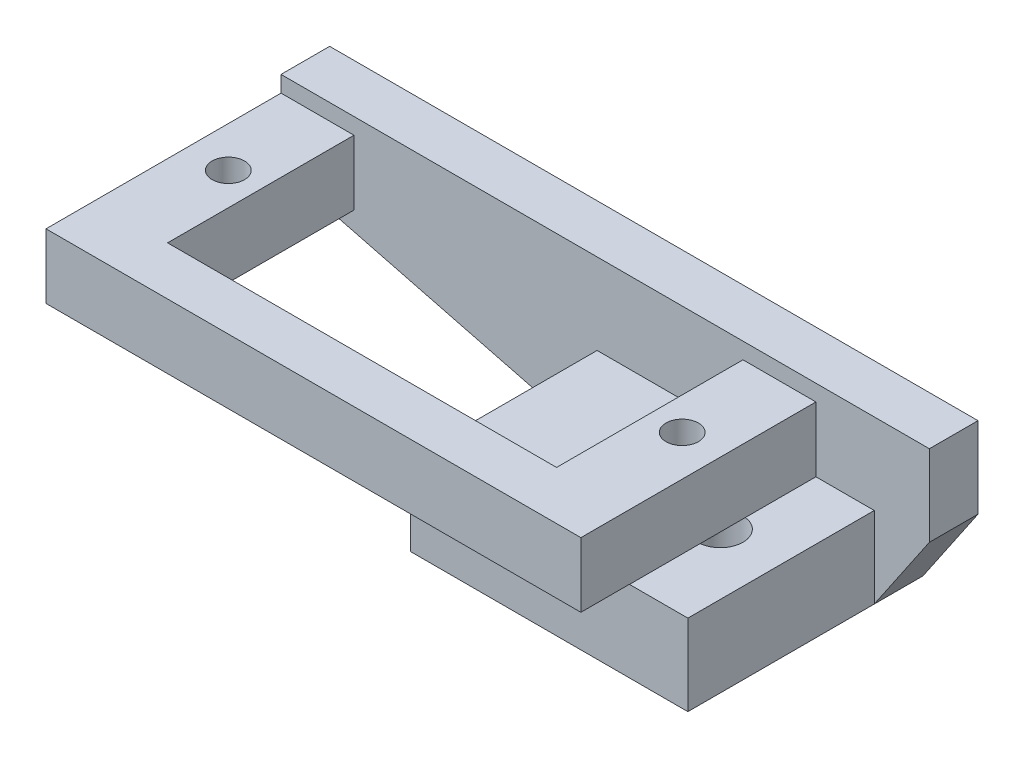
ISO-10303-21;
HEADER;
FILE_DESCRIPTION(('STEP AP214'),'2;1');
FILE_NAME('part.step','',(''),(''),'','','');
FILE_SCHEMA(('AUTOMOTIVE_DESIGN { 1 0 10303 214 1 1 1 1 }'));
ENDSEC;
DATA;
#1=APPLICATION_CONTEXT('core data for automotive mechanical design processes');
#2=APPLICATION_PROTOCOL_DEFINITION('international standard','automotive_design',2000,#1);
#3=PRODUCT_CONTEXT('',#1,'mechanical');
#4=PRODUCT('Part','Part','',(#3));
#5=PRODUCT_RELATED_PRODUCT_CATEGORY('part','',(#4));
#6=PRODUCT_DEFINITION_FORMATION('','',#4);
#7=PRODUCT_DEFINITION_CONTEXT('part definition',#1,'design');
#8=PRODUCT_DEFINITION('design','',#6,#7);
#9=PRODUCT_DEFINITION_SHAPE('','',#8);
#10=(LENGTH_UNIT() NAMED_UNIT(*) SI_UNIT(.MILLI.,.METRE.));
#11=(NAMED_UNIT(*) PLANE_ANGLE_UNIT() SI_UNIT($,.RADIAN.));
#12=(NAMED_UNIT(*) SI_UNIT($,.STERADIAN.) SOLID_ANGLE_UNIT());
#13=UNCERTAINTY_MEASURE_WITH_UNIT(LENGTH_MEASURE(1.E-05),#10,'distance_accuracy_value','');
#14=(GEOMETRIC_REPRESENTATION_CONTEXT(3) GLOBAL_UNCERTAINTY_ASSIGNED_CONTEXT((#13)) GLOBAL_UNIT_ASSIGNED_CONTEXT((#10,
#11,#12)) REPRESENTATION_CONTEXT('',''));
#15=CARTESIAN_POINT('',(0.,0.,0.));
#16=DIRECTION('',(0.,0.,1.));
#17=DIRECTION('',(1.,0.,0.));
#18=AXIS2_PLACEMENT_3D('',#15,#16,#17);
#19=CARTESIAN_POINT('',(0.,0.,14.5));
#20=DIRECTION('',(0.,0.,-1.));
#21=DIRECTION('',(-1.,0.,0.));
#22=AXIS2_PLACEMENT_3D('',#19,#20,#21);
#23=PLANE('',#22);
#24=DIRECTION('',(1.,0.,0.));
#25=VECTOR('',#24,1.);
#26=CARTESIAN_POINT('',(0.,-2.49,14.5));
#27=LINE('',#26,#25);
#28=CARTESIAN_POINT('',(-20.,-2.49,14.5));
#29=VERTEX_POINT('',#28);
#30=CARTESIAN_POINT('',(-15.5,-2.49,14.5));
#31=VERTEX_POINT('',#30);
#32=EDGE_CURVE('E51',#29,#31,#27,.T.);
#33=ORIENTED_EDGE('',*,*,#32,.F.);
#34=DIRECTION('',(0.,-1.,0.));
#35=VECTOR('',#34,1.);
#36=CARTESIAN_POINT('',(-20.,-2.5,14.5));
#37=LINE('',#36,#35);
#38=CARTESIAN_POINT('',(-20.,-2.5,14.5));
#39=VERTEX_POINT('',#38);
#40=EDGE_CURVE('E318',#29,#39,#37,.T.);
#41=ORIENTED_EDGE('',*,*,#40,.T.);
#42=DIRECTION('',(1.,0.,0.));
#43=VECTOR('',#42,1.);
#44=CARTESIAN_POINT('',(-20.,-2.5,14.5));
#45=LINE('',#44,#43);
#46=CARTESIAN_POINT('',(-15.5,-2.5,14.5));
#47=VERTEX_POINT('',#46);
#48=EDGE_CURVE('E320',#39,#47,#45,.T.);
#49=ORIENTED_EDGE('',*,*,#48,.T.);
#50=DIRECTION('',(0.,1.,0.));
#51=VECTOR('',#50,1.);
#52=CARTESIAN_POINT('',(-15.5,-2.5,14.5));
#53=LINE('',#52,#51);
#54=EDGE_CURVE('E323',#47,#31,#53,.T.);
#55=ORIENTED_EDGE('',*,*,#54,.T.);
#56=EDGE_LOOP('',(#33,#41,#49,#55));
#57=FACE_BOUND('',#56,.T.);
#58=ADVANCED_FACE('F40',(#57),#23,.F.);
#59=CARTESIAN_POINT('',(0.,0.,14.5));
#60=DIRECTION('',(0.,0.,-1.));
#61=DIRECTION('',(-1.,0.,0.));
#62=AXIS2_PLACEMENT_3D('',#59,#60,#61);
#63=PLANE('',#62);
#64=CARTESIAN_POINT('',(8.49999999999998,-2.49,14.5));
#65=VERTEX_POINT('',#64);
#66=CARTESIAN_POINT('',(13.,-2.49,14.5));
#67=VERTEX_POINT('',#66);
#68=EDGE_CURVE('E12',#65,#67,#27,.T.);
#69=ORIENTED_EDGE('',*,*,#68,.F.);
#70=DIRECTION('',(0.,-1.,0.));
#71=VECTOR('',#70,1.);
#72=CARTESIAN_POINT('',(8.49999999999998,-2.5,14.5));
#73=LINE('',#72,#71);
#74=CARTESIAN_POINT('',(8.49999999999999,-2.5,14.5));
#75=VERTEX_POINT('',#74);
#76=EDGE_CURVE('E297',#65,#75,#73,.T.);
#77=ORIENTED_EDGE('',*,*,#76,.T.);
#78=DIRECTION('',(-1.,0.,0.));
#79=VECTOR('',#78,1.);
#80=CARTESIAN_POINT('',(16.6,-2.5,14.5));
#81=LINE('',#80,#79);
#82=CARTESIAN_POINT('',(-0.499999999999997,-2.5,14.5));
#83=VERTEX_POINT('',#82);
#84=EDGE_CURVE('E274',#75,#83,#81,.T.);
#85=ORIENTED_EDGE('',*,*,#84,.T.);
#86=DIRECTION('',(0.,1.,0.));
#87=VECTOR('',#86,1.);
#88=CARTESIAN_POINT('',(-0.499999999999997,-7.5,14.5));
#89=LINE('',#88,#87);
#90=CARTESIAN_POINT('',(-0.499999999999997,-7.5,14.5));
#91=VERTEX_POINT('',#90);
#92=EDGE_CURVE('E272',#91,#83,#89,.T.);
#93=ORIENTED_EDGE('',*,*,#92,.F.);
#94=DIRECTION('',(-1.,0.,0.));
#95=VECTOR('',#94,1.);
#96=CARTESIAN_POINT('',(16.6,-7.5,14.5));
#97=LINE('',#96,#95);
#98=CARTESIAN_POINT('',(16.6,-7.5,14.5));
#99=VERTEX_POINT('',#98);
#100=EDGE_CURVE('E264',#99,#91,#97,.T.);
#101=ORIENTED_EDGE('',*,*,#100,.F.);
#102=DIRECTION('',(0.,1.,0.));
#103=VECTOR('',#102,1.);
#104=CARTESIAN_POINT('',(16.6,-7.5,14.5));
#105=LINE('',#104,#103);
#106=CARTESIAN_POINT('',(16.6,-2.5,14.5));
#107=VERTEX_POINT('',#106);
#108=EDGE_CURVE('E280',#99,#107,#105,.T.);
#109=ORIENTED_EDGE('',*,*,#108,.T.);
#110=CARTESIAN_POINT('',(13.,-2.5,14.5));
#111=VERTEX_POINT('',#110);
#112=EDGE_CURVE('E190',#107,#111,#81,.T.);
#113=ORIENTED_EDGE('',*,*,#112,.T.);
#114=DIRECTION('',(0.,1.,0.));
#115=VECTOR('',#114,1.);
#116=CARTESIAN_POINT('',(13.,-2.5,14.5));
#117=LINE('',#116,#115);
#118=EDGE_CURVE('E186',#111,#67,#117,.T.);
#119=ORIENTED_EDGE('',*,*,#118,.T.);
#120=EDGE_LOOP('',(#69,#77,#85,#93,#101,#109,#113,#119));
#121=FACE_BOUND('',#120,.T.);
#122=ADVANCED_FACE('F187',(#121),#63,.F.);
#123=CARTESIAN_POINT('',(0.,-7.5,0.));
#124=DIRECTION('',(0.,-1.,0.));
#125=DIRECTION('',(0.,0.,-1.));
#126=AXIS2_PLACEMENT_3D('',#123,#124,#125);
#127=PLANE('',#126);
#128=CARTESIAN_POINT('',(12.85,-7.5,8.75));
#129=DIRECTION('',(0.,-1.,0.));
#130=DIRECTION('',(0.,0.,-1.));
#131=AXIS2_PLACEMENT_3D('',#128,#129,#130);
#132=CIRCLE('',#131,3.40000000000001);
#133=CARTESIAN_POINT('',(12.85,-7.5,5.34999999999999));
#134=VERTEX_POINT('',#133);
#135=EDGE_CURVE('E366',#134,#134,#132,.F.);
#136=ORIENTED_EDGE('',*,*,#135,.T.);
#137=EDGE_LOOP('',(#136));
#138=FACE_BOUND('',#137,.T.);
#139=DIRECTION('',(0.,0.,1.));
#140=VECTOR('',#139,1.);
#141=CARTESIAN_POINT('',(16.6,-7.5,0.));
#142=LINE('',#141,#140);
#143=CARTESIAN_POINT('',(16.6,-7.5,0.));
#144=VERTEX_POINT('',#143);
#145=CARTESIAN_POINT('',(16.6,-7.5,3.));
#146=VERTEX_POINT('',#145);
#147=EDGE_CURVE('E262',#144,#146,#142,.T.);
#148=ORIENTED_EDGE('',*,*,#147,.T.);
#149=EDGE_CURVE('E265',#146,#99,#142,.T.);
#150=ORIENTED_EDGE('',*,*,#149,.T.);
#151=ORIENTED_EDGE('',*,*,#100,.T.);
#152=DIRECTION('',(0.,0.,-1.));
#153=VECTOR('',#152,1.);
#154=CARTESIAN_POINT('',(-0.499999999999997,-7.5,0.));
#155=LINE('',#154,#153);
#156=CARTESIAN_POINT('',(-0.499999999999997,-7.5,3.));
#157=VERTEX_POINT('',#156);
#158=EDGE_CURVE('E267',#91,#157,#155,.T.);
#159=ORIENTED_EDGE('',*,*,#158,.T.);
#160=DIRECTION('',(0.,0.,-1.));
#161=VECTOR('',#160,1.);
#162=CARTESIAN_POINT('',(-0.499999999999997,-7.5,23.1308221391974));
#163=LINE('',#162,#161);
#164=CARTESIAN_POINT('',(-0.499999999999997,-7.5,0.));
#165=VERTEX_POINT('',#164);
#166=EDGE_CURVE('E241',#157,#165,#163,.T.);
#167=ORIENTED_EDGE('',*,*,#166,.T.);
#168=DIRECTION('',(1.,0.,0.));
#169=VECTOR('',#168,1.);
#170=CARTESIAN_POINT('',(16.6,-7.5,0.));
#171=LINE('',#170,#169);
#172=EDGE_CURVE('E270',#165,#144,#171,.T.);
#173=ORIENTED_EDGE('',*,*,#172,.T.);
#174=EDGE_LOOP('',(#148,#150,#151,#159,#167,#173));
#175=FACE_BOUND('',#174,.T.);
#176=ADVANCED_FACE('F420',(#138,#175),#127,.T.);
#177=CARTESIAN_POINT('',(-20.,-2.5,3.));
#178=DIRECTION('',(0.,1.,0.));
#179=DIRECTION('',(0.,0.,1.));
#180=AXIS2_PLACEMENT_3D('',#177,#178,#179);
#181=PLANE('',#180);
#182=CARTESIAN_POINT('',(-17.5,-2.5,8.75));
#183=DIRECTION('',(0.,1.,0.));
#184=DIRECTION('',(0.,0.,1.));
#185=AXIS2_PLACEMENT_3D('',#182,#183,#184);
#186=CIRCLE('',#185,1.);
#187=CARTESIAN_POINT('',(-17.5,-2.5,9.75));
#188=VERTEX_POINT('',#187);
#189=EDGE_CURVE('E283',#188,#188,#186,.T.);
#190=ORIENTED_EDGE('',*,*,#189,.T.);
#191=EDGE_LOOP('',(#190));
#192=FACE_BOUND('',#191,.T.);
#193=DIRECTION('',(-1.,0.,0.));
#194=VECTOR('',#193,1.);
#195=CARTESIAN_POINT('',(-20.,-2.5,3.));
#196=LINE('',#195,#194);
#197=CARTESIAN_POINT('',(-15.5,-2.5,3.));
#198=VERTEX_POINT('',#197);
#199=CARTESIAN_POINT('',(-20.,-2.5,3.));
#200=VERTEX_POINT('',#199);
#201=EDGE_CURVE('E234',#198,#200,#196,.T.);
#202=ORIENTED_EDGE('',*,*,#201,.F.);
#203=DIRECTION('',(0.,0.,-1.));
#204=VECTOR('',#203,1.);
#205=CARTESIAN_POINT('',(-15.5,-2.5,14.5));
#206=LINE('',#205,#204);
#207=EDGE_CURVE('E335',#47,#198,#206,.T.);
#208=ORIENTED_EDGE('',*,*,#207,.F.);
#209=ORIENTED_EDGE('',*,*,#48,.F.);
#210=DIRECTION('',(0.,0.,-1.));
#211=VECTOR('',#210,1.);
#212=CARTESIAN_POINT('',(-20.,-2.5,3.));
#213=LINE('',#212,#211);
#214=EDGE_CURVE('E358',#39,#200,#213,.T.);
#215=ORIENTED_EDGE('',*,*,#214,.T.);
#216=EDGE_LOOP('',(#202,#208,#209,#215));
#217=FACE_BOUND('',#216,.T.);
#218=ADVANCED_FACE('F444',(#192,#217),#181,.F.);
#219=CARTESIAN_POINT('',(-0.499999999999997,-7.5,0.));
#220=DIRECTION('',(1.,0.,0.));
#221=DIRECTION('',(0.,0.,-1.));
#222=AXIS2_PLACEMENT_3D('',#219,#220,#221);
#223=PLANE('',#222);
#224=DIRECTION('',(0.,1.,0.));
#225=VECTOR('',#224,1.);
#226=CARTESIAN_POINT('',(-0.499999999999997,-7.5,3.));
#227=LINE('',#226,#225);
#228=CARTESIAN_POINT('',(-0.499999999999997,-2.5,3.));
#229=VERTEX_POINT('',#228);
#230=EDGE_CURVE('E238',#157,#229,#227,.T.);
#231=ORIENTED_EDGE('',*,*,#230,.F.);
#232=ORIENTED_EDGE('',*,*,#158,.F.);
#233=ORIENTED_EDGE('',*,*,#92,.T.);
#234=DIRECTION('',(0.,0.,-1.));
#235=VECTOR('',#234,1.);
#236=CARTESIAN_POINT('',(-0.499999999999997,-2.5,0.));
#237=LINE('',#236,#235);
#238=EDGE_CURVE('E276',#83,#229,#237,.T.);
#239=ORIENTED_EDGE('',*,*,#238,.T.);
#240=EDGE_LOOP('',(#231,#232,#233,#239));
#241=FACE_BOUND('',#240,.T.);
#242=ADVANCED_FACE('F447',(#241),#223,.F.);
#243=CARTESIAN_POINT('',(16.6,-7.5,0.));
#244=DIRECTION('',(-1.,0.,0.));
#245=DIRECTION('',(0.,0.,1.));
#246=AXIS2_PLACEMENT_3D('',#243,#244,#245);
#247=PLANE('',#246);
#248=DIRECTION('',(0.,-1.,0.));
#249=VECTOR('',#248,1.);
#250=CARTESIAN_POINT('',(16.6,-7.5,3.));
#251=LINE('',#250,#249);
#252=CARTESIAN_POINT('',(16.6,-2.5,3.));
#253=VERTEX_POINT('',#252);
#254=EDGE_CURVE('E248',#253,#146,#251,.T.);
#255=ORIENTED_EDGE('',*,*,#254,.F.);
#256=DIRECTION('',(0.,0.,1.));
#257=VECTOR('',#256,1.);
#258=CARTESIAN_POINT('',(16.6,-2.5,0.));
#259=LINE('',#258,#257);
#260=EDGE_CURVE('E260',#253,#107,#259,.T.);
#261=ORIENTED_EDGE('',*,*,#260,.T.);
#262=ORIENTED_EDGE('',*,*,#108,.F.);
#263=ORIENTED_EDGE('',*,*,#149,.F.);
#264=EDGE_LOOP('',(#255,#261,#262,#263));
#265=FACE_BOUND('',#264,.T.);
#266=ADVANCED_FACE('F473',(#265),#247,.F.);
#267=DIRECTION('',(0.,0.,-1.));
#268=VECTOR('',#267,1.);
#269=CARTESIAN_POINT('',(13.,-2.5,14.5));
#270=LINE('',#269,#268);
#271=CARTESIAN_POINT('',(13.,-2.5,10.1419410907075));
#272=VERTEX_POINT('',#271);
#273=CARTESIAN_POINT('',(13.,-2.5,7.35805890929249));
#274=VERTEX_POINT('',#273);
#275=EDGE_CURVE('E315',#272,#274,#270,.T.);
#276=ORIENTED_EDGE('',*,*,#275,.F.);
#277=CARTESIAN_POINT('',(12.85,-2.5,8.75));
#278=DIRECTION('',(0.,-1.,0.));
#279=DIRECTION('',(0.,0.,-1.));
#280=AXIS2_PLACEMENT_3D('',#277,#278,#279);
#281=CIRCLE('',#280,1.4);
#282=CARTESIAN_POINT('',(11.4707446808511,-2.5,8.99011406580908));
#283=VERTEX_POINT('',#282);
#284=EDGE_CURVE('E368',#272,#283,#281,.T.);
#285=ORIENTED_EDGE('',*,*,#284,.T.);
#286=CARTESIAN_POINT('',(10.5,-2.5,8.75));
#287=DIRECTION('',(0.,1.,0.));
#288=DIRECTION('',(0.,0.,-1.));
#289=AXIS2_PLACEMENT_3D('',#286,#287,#288);
#290=CIRCLE('',#289,1.);
#291=CARTESIAN_POINT('',(11.4707446808511,-2.5,8.50988593419091));
#292=VERTEX_POINT('',#291);
#293=EDGE_CURVE('E290',#283,#292,#290,.T.);
#294=ORIENTED_EDGE('',*,*,#293,.T.);
#295=EDGE_CURVE('E261',#292,#274,#281,.T.);
#296=ORIENTED_EDGE('',*,*,#295,.T.);
#297=EDGE_LOOP('',(#276,#285,#294,#296));
#298=FACE_BOUND('',#297,.T.);
#299=ADVANCED_FACE('F386',(#298),#181,.F.);
#300=CARTESIAN_POINT('',(0.,0.,3.));
#301=DIRECTION('',(0.,0.,-1.));
#302=DIRECTION('',(-1.,0.,0.));
#303=AXIS2_PLACEMENT_3D('',#300,#301,#302);
#304=PLANE('',#303);
#305=DIRECTION('',(0.,-1.,0.));
#306=VECTOR('',#305,1.);
#307=CARTESIAN_POINT('',(8.49999999999998,-2.5,3.));
#308=LINE('',#307,#306);
#309=CARTESIAN_POINT('',(8.49999999999998,1.5,3.));
#310=VERTEX_POINT('',#309);
#311=CARTESIAN_POINT('',(8.49999999999999,-2.5,3.));
#312=VERTEX_POINT('',#311);
#313=EDGE_CURVE('E286',#310,#312,#308,.T.);
#314=ORIENTED_EDGE('',*,*,#313,.F.);
#315=DIRECTION('',(-1.,0.,0.));
#316=VECTOR('',#315,1.);
#317=CARTESIAN_POINT('',(8.49999999999998,1.5,3.));
#318=LINE('',#317,#316);
#319=CARTESIAN_POINT('',(13.,1.5,3.));
#320=VERTEX_POINT('',#319);
#321=EDGE_CURVE('E303',#320,#310,#318,.T.);
#322=ORIENTED_EDGE('',*,*,#321,.F.);
#323=DIRECTION('',(0.,1.,0.));
#324=VECTOR('',#323,1.);
#325=CARTESIAN_POINT('',(13.,-2.5,3.));
#326=LINE('',#325,#324);
#327=CARTESIAN_POINT('',(13.,-2.5,3.));
#328=VERTEX_POINT('',#327);
#329=EDGE_CURVE('E301',#328,#320,#326,.T.);
#330=ORIENTED_EDGE('',*,*,#329,.F.);
#331=DIRECTION('',(1.,0.,0.));
#332=VECTOR('',#331,1.);
#333=CARTESIAN_POINT('',(-20.,-2.5,3.));
#334=LINE('',#333,#332);
#335=EDGE_CURVE('E347',#328,#253,#334,.T.);
#336=ORIENTED_EDGE('',*,*,#335,.T.);
#337=ORIENTED_EDGE('',*,*,#254,.T.);
#338=DIRECTION('',(0.562310021407277,0.82692650206953,0.));
#339=VECTOR('',#338,1.);
#340=CARTESIAN_POINT('',(20.,-2.5,3.));
#341=LINE('',#340,#339);
#342=CARTESIAN_POINT('',(20.,-2.5,3.));
#343=VERTEX_POINT('',#342);
#344=EDGE_CURVE('E251',#146,#343,#341,.T.);
#345=ORIENTED_EDGE('',*,*,#344,.T.);
#346=DIRECTION('',(0.,1.,0.));
#347=VECTOR('',#346,1.);
#348=CARTESIAN_POINT('',(20.,-2.5,3.));
#349=LINE('',#348,#347);
#350=CARTESIAN_POINT('',(20.,2.5,3.));
#351=VERTEX_POINT('',#350);
#352=EDGE_CURVE('E339',#343,#351,#349,.T.);
#353=ORIENTED_EDGE('',*,*,#352,.T.);
#354=DIRECTION('',(-1.,0.,0.));
#355=VECTOR('',#354,1.);
#356=CARTESIAN_POINT('',(-20.,2.5,3.));
#357=LINE('',#356,#355);
#358=CARTESIAN_POINT('',(-20.,2.5,3.));
#359=VERTEX_POINT('',#358);
#360=EDGE_CURVE('E342',#351,#359,#357,.T.);
#361=ORIENTED_EDGE('',*,*,#360,.T.);
#362=DIRECTION('',(0.,-1.,0.));
#363=VECTOR('',#362,1.);
#364=CARTESIAN_POINT('',(-20.,-2.5,3.));
#365=LINE('',#364,#363);
#366=CARTESIAN_POINT('',(-20.,1.5,3.));
#367=VERTEX_POINT('',#366);
#368=EDGE_CURVE('E345',#359,#367,#365,.T.);
#369=ORIENTED_EDGE('',*,*,#368,.T.);
#370=DIRECTION('',(-1.,0.,0.));
#371=VECTOR('',#370,1.);
#372=CARTESIAN_POINT('',(-20.,1.5,3.));
#373=LINE('',#372,#371);
#374=CARTESIAN_POINT('',(-15.5,1.5,3.));
#375=VERTEX_POINT('',#374);
#376=EDGE_CURVE('E321',#375,#367,#373,.T.);
#377=ORIENTED_EDGE('',*,*,#376,.F.);
#378=DIRECTION('',(0.,1.,0.));
#379=VECTOR('',#378,1.);
#380=CARTESIAN_POINT('',(-15.5,-2.5,3.));
#381=LINE('',#380,#379);
#382=EDGE_CURVE('E317',#198,#375,#381,.T.);
#383=ORIENTED_EDGE('',*,*,#382,.F.);
#384=ORIENTED_EDGE('',*,*,#201,.T.);
#385=DIRECTION('',(0.968663866044045,-0.248375350267704,0.));
#386=VECTOR('',#385,1.);
#387=CARTESIAN_POINT('',(-20.,-2.5,3.));
#388=LINE('',#387,#386);
#389=EDGE_CURVE('E231',#200,#157,#388,.T.);
#390=ORIENTED_EDGE('',*,*,#389,.T.);
#391=ORIENTED_EDGE('',*,*,#230,.T.);
#392=EDGE_CURVE('E348',#229,#312,#334,.T.);
#393=ORIENTED_EDGE('',*,*,#392,.T.);
#394=EDGE_LOOP('',(#314,#322,#330,#336,#337,#345,#353,#361,#369,#377,#383,#384,#390,#391,#393));
#395=FACE_BOUND('',#394,.T.);
#396=ADVANCED_FACE('F435',(#395),#304,.F.);
#397=CARTESIAN_POINT('',(20.,-2.5,3.));
#398=DIRECTION('',(-1.,0.,0.));
#399=DIRECTION('',(0.,0.,1.));
#400=AXIS2_PLACEMENT_3D('',#397,#398,#399);
#401=PLANE('',#400);
#402=DIRECTION('',(0.,1.,0.));
#403=VECTOR('',#402,1.);
#404=CARTESIAN_POINT('',(20.,-2.5,0.));
#405=LINE('',#404,#403);
#406=CARTESIAN_POINT('',(20.,-2.5,0.));
#407=VERTEX_POINT('',#406);
#408=CARTESIAN_POINT('',(20.,2.5,0.));
#409=VERTEX_POINT('',#408);
#410=EDGE_CURVE('E338',#407,#409,#405,.T.);
#411=ORIENTED_EDGE('',*,*,#410,.T.);
#412=DIRECTION('',(0.,0.,-1.));
#413=VECTOR('',#412,1.);
#414=CARTESIAN_POINT('',(20.,2.5,3.));
#415=LINE('',#414,#413);
#416=EDGE_CURVE('E364',#351,#409,#415,.T.);
#417=ORIENTED_EDGE('',*,*,#416,.F.);
#418=ORIENTED_EDGE('',*,*,#352,.F.);
#419=DIRECTION('',(0.,0.,-1.));
#420=VECTOR('',#419,1.);
#421=CARTESIAN_POINT('',(20.,-2.5,3.));
#422=LINE('',#421,#420);
#423=EDGE_CURVE('E351',#343,#407,#422,.T.);
#424=ORIENTED_EDGE('',*,*,#423,.T.);
#425=EDGE_LOOP('',(#411,#417,#418,#424));
#426=FACE_BOUND('',#425,.T.);
#427=ADVANCED_FACE('F438',(#426),#401,.F.);
#428=CARTESIAN_POINT('',(-20.,2.5,3.));
#429=DIRECTION('',(0.,-1.,0.));
#430=DIRECTION('',(0.,0.,-1.));
#431=AXIS2_PLACEMENT_3D('',#428,#429,#430);
#432=PLANE('',#431);
#433=DIRECTION('',(-1.,0.,0.));
#434=VECTOR('',#433,1.);
#435=CARTESIAN_POINT('',(-20.,2.5,0.));
#436=LINE('',#435,#434);
#437=CARTESIAN_POINT('',(-20.,2.5,0.));
#438=VERTEX_POINT('',#437);
#439=EDGE_CURVE('E354',#409,#438,#436,.T.);
#440=ORIENTED_EDGE('',*,*,#439,.T.);
#441=DIRECTION('',(0.,0.,-1.));
#442=VECTOR('',#441,1.);
#443=CARTESIAN_POINT('',(-20.,2.5,3.));
#444=LINE('',#443,#442);
#445=EDGE_CURVE('E361',#359,#438,#444,.T.);
#446=ORIENTED_EDGE('',*,*,#445,.F.);
#447=ORIENTED_EDGE('',*,*,#360,.F.);
#448=ORIENTED_EDGE('',*,*,#416,.T.);
#449=EDGE_LOOP('',(#440,#446,#447,#448));
#450=FACE_BOUND('',#449,.T.);
#451=ADVANCED_FACE('F451',(#450),#432,.F.);
#452=CARTESIAN_POINT('',(-20.,-2.5,3.));
#453=DIRECTION('',(1.,0.,0.));
#454=DIRECTION('',(0.,0.,-1.));
#455=AXIS2_PLACEMENT_3D('',#452,#453,#454);
#456=PLANE('',#455);
#457=DIRECTION('',(0.,-1.,0.));
#458=VECTOR('',#457,1.);
#459=CARTESIAN_POINT('',(-20.,-2.5,0.));
#460=LINE('',#459,#458);
#461=CARTESIAN_POINT('',(-20.,-2.5,0.));
#462=VERTEX_POINT('',#461);
#463=EDGE_CURVE('E343',#438,#462,#460,.T.);
#464=ORIENTED_EDGE('',*,*,#463,.T.);
#465=DIRECTION('',(0.,0.,-1.));
#466=VECTOR('',#465,1.);
#467=CARTESIAN_POINT('',(-20.,-2.5,23.1308221391974));
#468=LINE('',#467,#466);
#469=EDGE_CURVE('E235',#200,#462,#468,.T.);
#470=ORIENTED_EDGE('',*,*,#469,.F.);
#471=ORIENTED_EDGE('',*,*,#214,.F.);
#472=ORIENTED_EDGE('',*,*,#40,.F.);
#473=DIRECTION('',(0.,0.,1.));
#474=VECTOR('',#473,1.);
#475=CARTESIAN_POINT('',(-20.,-2.49,0.));
#476=LINE('',#475,#474);
#477=CARTESIAN_POINT('',(-20.,-2.49,17.5));
#478=VERTEX_POINT('',#477);
#479=EDGE_CURVE('E215',#29,#478,#476,.T.);
#480=ORIENTED_EDGE('',*,*,#479,.T.);
#481=DIRECTION('',(0.,1.,0.));
#482=VECTOR('',#481,1.);
#483=CARTESIAN_POINT('',(-20.,-2.49,17.5));
#484=LINE('',#483,#482);
#485=CARTESIAN_POINT('',(-20.,1.5,17.5));
#486=VERTEX_POINT('',#485);
#487=EDGE_CURVE('E220',#478,#486,#484,.T.);
#488=ORIENTED_EDGE('',*,*,#487,.T.);
#489=DIRECTION('',(0.,0.,-1.));
#490=VECTOR('',#489,1.);
#491=CARTESIAN_POINT('',(-20.,1.5,14.5));
#492=LINE('',#491,#490);
#493=EDGE_CURVE('E325',#486,#367,#492,.T.);
#494=ORIENTED_EDGE('',*,*,#493,.T.);
#495=ORIENTED_EDGE('',*,*,#368,.F.);
#496=ORIENTED_EDGE('',*,*,#445,.T.);
#497=EDGE_LOOP('',(#464,#470,#471,#472,#480,#488,#494,#495,#496));
#498=FACE_BOUND('',#497,.T.);
#499=ADVANCED_FACE('F442',(#498),#456,.F.);
#500=CARTESIAN_POINT('',(0.,0.,0.));
#501=DIRECTION('',(0.,0.,-1.));
#502=DIRECTION('',(-1.,0.,0.));
#503=AXIS2_PLACEMENT_3D('',#500,#501,#502);
#504=PLANE('',#503);
#505=ORIENTED_EDGE('',*,*,#410,.F.);
#506=DIRECTION('',(-0.562310021407277,-0.82692650206953,0.));
#507=VECTOR('',#506,1.);
#508=CARTESIAN_POINT('',(20.,-2.5,0.));
#509=LINE('',#508,#507);
#510=EDGE_CURVE('E247',#407,#144,#509,.T.);
#511=ORIENTED_EDGE('',*,*,#510,.T.);
#512=ORIENTED_EDGE('',*,*,#172,.F.);
#513=DIRECTION('',(-0.968663866044045,0.248375350267704,0.));
#514=VECTOR('',#513,1.);
#515=CARTESIAN_POINT('',(-20.,-2.5,0.));
#516=LINE('',#515,#514);
#517=EDGE_CURVE('E230',#165,#462,#516,.T.);
#518=ORIENTED_EDGE('',*,*,#517,.T.);
#519=ORIENTED_EDGE('',*,*,#463,.F.);
#520=ORIENTED_EDGE('',*,*,#439,.F.);
#521=EDGE_LOOP('',(#505,#511,#512,#518,#519,#520));
#522=FACE_BOUND('',#521,.T.);
#523=ADVANCED_FACE('F433',(#522),#504,.T.);
#524=CARTESIAN_POINT('',(-15.5,-2.5,14.5));
#525=DIRECTION('',(-1.,0.,0.));
#526=DIRECTION('',(0.,0.,1.));
#527=AXIS2_PLACEMENT_3D('',#524,#525,#526);
#528=PLANE('',#527);
#529=ORIENTED_EDGE('',*,*,#382,.T.);
#530=DIRECTION('',(0.,0.,-1.));
#531=VECTOR('',#530,1.);
#532=CARTESIAN_POINT('',(-15.5,1.5,14.5));
#533=LINE('',#532,#531);
#534=CARTESIAN_POINT('',(-15.5,1.5,14.5));
#535=VERTEX_POINT('',#534);
#536=EDGE_CURVE('E332',#535,#375,#533,.T.);
#537=ORIENTED_EDGE('',*,*,#536,.F.);
#538=EDGE_CURVE('E224',#31,#535,#53,.T.);
#539=ORIENTED_EDGE('',*,*,#538,.F.);
#540=ORIENTED_EDGE('',*,*,#54,.F.);
#541=ORIENTED_EDGE('',*,*,#207,.T.);
#542=EDGE_LOOP('',(#529,#537,#539,#540,#541));
#543=FACE_BOUND('',#542,.T.);
#544=ADVANCED_FACE('F429',(#543),#528,.F.);
#545=CARTESIAN_POINT('',(-20.,1.5,14.5));
#546=DIRECTION('',(0.,-1.,0.));
#547=DIRECTION('',(0.,0.,-1.));
#548=AXIS2_PLACEMENT_3D('',#545,#546,#547);
#549=PLANE('',#548);
#550=CARTESIAN_POINT('',(-17.5,1.5,8.75));
#551=DIRECTION('',(0.,1.,0.));
#552=DIRECTION('',(0.,0.,1.));
#553=AXIS2_PLACEMENT_3D('',#550,#551,#552);
#554=CIRCLE('',#553,1.);
#555=CARTESIAN_POINT('',(-17.5,1.5,9.75));
#556=VERTEX_POINT('',#555);
#557=EDGE_CURVE('E287',#556,#556,#554,.T.);
#558=ORIENTED_EDGE('',*,*,#557,.F.);
#559=EDGE_LOOP('',(#558));
#560=FACE_BOUND('',#559,.T.);
#561=ORIENTED_EDGE('',*,*,#376,.T.);
#562=ORIENTED_EDGE('',*,*,#493,.F.);
#563=DIRECTION('',(1.,0.,0.));
#564=VECTOR('',#563,1.);
#565=CARTESIAN_POINT('',(0.,1.5,17.5));
#566=LINE('',#565,#564);
#567=CARTESIAN_POINT('',(13.,1.5,17.5));
#568=VERTEX_POINT('',#567);
#569=EDGE_CURVE('E209',#486,#568,#566,.T.);
#570=ORIENTED_EDGE('',*,*,#569,.T.);
#571=DIRECTION('',(0.,0.,-1.));
#572=VECTOR('',#571,1.);
#573=CARTESIAN_POINT('',(13.,1.5,14.5));
#574=LINE('',#573,#572);
#575=EDGE_CURVE('E308',#568,#320,#574,.T.);
#576=ORIENTED_EDGE('',*,*,#575,.T.);
#577=ORIENTED_EDGE('',*,*,#321,.T.);
#578=DIRECTION('',(0.,0.,-1.));
#579=VECTOR('',#578,1.);
#580=CARTESIAN_POINT('',(8.49999999999998,1.5,14.5));
#581=LINE('',#580,#579);
#582=CARTESIAN_POINT('',(8.49999999999998,1.5,14.5));
#583=VERTEX_POINT('',#582);
#584=EDGE_CURVE('E194',#583,#310,#581,.T.);
#585=ORIENTED_EDGE('',*,*,#584,.F.);
#586=DIRECTION('',(1.,0.,0.));
#587=VECTOR('',#586,1.);
#588=CARTESIAN_POINT('',(0.,1.5,14.5));
#589=LINE('',#588,#587);
#590=EDGE_CURVE('E212',#535,#583,#589,.T.);
#591=ORIENTED_EDGE('',*,*,#590,.F.);
#592=ORIENTED_EDGE('',*,*,#536,.T.);
#593=EDGE_LOOP('',(#561,#562,#570,#576,#577,#585,#591,#592));
#594=FACE_BOUND('',#593,.T.);
#595=CARTESIAN_POINT('',(10.5,1.5,8.75));
#596=DIRECTION('',(0.,1.,0.));
#597=DIRECTION('',(0.,0.,-1.));
#598=AXIS2_PLACEMENT_3D('',#595,#596,#597);
#599=CIRCLE('',#598,1.);
#600=CARTESIAN_POINT('',(10.5,1.5,7.74999999999999));
#601=VERTEX_POINT('',#600);
#602=EDGE_CURVE('E282',#601,#601,#599,.T.);
#603=ORIENTED_EDGE('',*,*,#602,.F.);
#604=EDGE_LOOP('',(#603));
#605=FACE_BOUND('',#604,.T.);
#606=ADVANCED_FACE('F426',(#560,#594,#605),#549,.F.);
#607=CARTESIAN_POINT('',(8.49999999999998,-2.5,14.5));
#608=DIRECTION('',(1.,0.,0.));
#609=DIRECTION('',(0.,0.,-1.));
#610=AXIS2_PLACEMENT_3D('',#607,#608,#609);
#611=PLANE('',#610);
#612=ORIENTED_EDGE('',*,*,#313,.T.);
#613=DIRECTION('',(0.,0.,-1.));
#614=VECTOR('',#613,1.);
#615=CARTESIAN_POINT('',(8.49999999999998,-2.5,14.5));
#616=LINE('',#615,#614);
#617=EDGE_CURVE('E314',#75,#312,#616,.T.);
#618=ORIENTED_EDGE('',*,*,#617,.F.);
#619=ORIENTED_EDGE('',*,*,#76,.F.);
#620=EDGE_CURVE('E195',#583,#65,#73,.T.);
#621=ORIENTED_EDGE('',*,*,#620,.F.);
#622=ORIENTED_EDGE('',*,*,#584,.T.);
#623=EDGE_LOOP('',(#612,#618,#619,#621,#622));
#624=FACE_BOUND('',#623,.T.);
#625=ADVANCED_FACE('F424',(#624),#611,.F.);
#626=CARTESIAN_POINT('',(13.,-2.5,14.5));
#627=DIRECTION('',(-1.,0.,0.));
#628=DIRECTION('',(0.,0.,1.));
#629=AXIS2_PLACEMENT_3D('',#626,#627,#628);
#630=PLANE('',#629);
#631=ORIENTED_EDGE('',*,*,#329,.T.);
#632=ORIENTED_EDGE('',*,*,#575,.F.);
#633=DIRECTION('',(0.,1.,0.));
#634=VECTOR('',#633,1.);
#635=CARTESIAN_POINT('',(13.,-2.49,17.5));
#636=LINE('',#635,#634);
#637=CARTESIAN_POINT('',(13.,-2.49,17.5));
#638=VERTEX_POINT('',#637);
#639=EDGE_CURVE('E207',#638,#568,#636,.T.);
#640=ORIENTED_EDGE('',*,*,#639,.F.);
#641=DIRECTION('',(0.,0.,1.));
#642=VECTOR('',#641,1.);
#643=CARTESIAN_POINT('',(13.,-2.49,0.));
#644=LINE('',#643,#642);
#645=EDGE_CURVE('E201',#67,#638,#644,.T.);
#646=ORIENTED_EDGE('',*,*,#645,.F.);
#647=ORIENTED_EDGE('',*,*,#118,.F.);
#648=EDGE_CURVE('E312',#111,#272,#270,.T.);
#649=ORIENTED_EDGE('',*,*,#648,.T.);
#650=ORIENTED_EDGE('',*,*,#275,.T.);
#651=EDGE_CURVE('E311',#274,#328,#270,.T.);
#652=ORIENTED_EDGE('',*,*,#651,.T.);
#653=EDGE_LOOP('',(#631,#632,#640,#646,#647,#649,#650,#652));
#654=FACE_BOUND('',#653,.T.);
#655=ADVANCED_FACE('F205',(#654),#630,.F.);
#656=CARTESIAN_POINT('',(10.5,-2.5,8.75));
#657=DIRECTION('',(0.,1.,0.));
#658=DIRECTION('',(0.,0.,1.));
#659=AXIS2_PLACEMENT_3D('',#656,#657,#658);
#660=CYLINDRICAL_SURFACE('',#659,1.);
#661=ORIENTED_EDGE('',*,*,#293,.F.);
#662=EDGE_CURVE('E293',#292,#283,#290,.T.);
#663=ORIENTED_EDGE('',*,*,#662,.F.);
#664=EDGE_LOOP('',(#661,#663));
#665=FACE_BOUND('',#664,.T.);
#666=ORIENTED_EDGE('',*,*,#602,.T.);
#667=EDGE_LOOP('',(#666));
#668=FACE_BOUND('',#667,.T.);
#669=ADVANCED_FACE('F384',(#665,#668),#660,.F.);
#670=CARTESIAN_POINT('',(-17.5,-2.5,8.75));
#671=DIRECTION('',(0.,1.,0.));
#672=DIRECTION('',(0.,0.,1.));
#673=AXIS2_PLACEMENT_3D('',#670,#671,#672);
#674=CYLINDRICAL_SURFACE('',#673,1.);
#675=ORIENTED_EDGE('',*,*,#189,.F.);
#676=EDGE_LOOP('',(#675));
#677=FACE_BOUND('',#676,.T.);
#678=ORIENTED_EDGE('',*,*,#557,.T.);
#679=EDGE_LOOP('',(#678));
#680=FACE_BOUND('',#679,.T.);
#681=ADVANCED_FACE('F516',(#677,#680),#674,.F.);
#682=CARTESIAN_POINT('',(0.,-2.5,0.));
#683=DIRECTION('',(0.,-1.,0.));
#684=DIRECTION('',(0.,0.,-1.));
#685=AXIS2_PLACEMENT_3D('',#682,#683,#684);
#686=PLANE('',#685);
#687=EDGE_CURVE('E256',#283,#292,#281,.T.);
#688=ORIENTED_EDGE('',*,*,#687,.T.);
#689=ORIENTED_EDGE('',*,*,#662,.T.);
#690=EDGE_LOOP('',(#688,#689));
#691=FACE_BOUND('',#690,.T.);
#692=ADVANCED_FACE('F381',(#691),#686,.F.);
#693=ORIENTED_EDGE('',*,*,#84,.F.);
#694=ORIENTED_EDGE('',*,*,#617,.T.);
#695=ORIENTED_EDGE('',*,*,#392,.F.);
#696=ORIENTED_EDGE('',*,*,#238,.F.);
#697=EDGE_LOOP('',(#693,#694,#695,#696));
#698=FACE_BOUND('',#697,.T.);
#699=ADVANCED_FACE('F498',(#698),#686,.F.);
#700=ORIENTED_EDGE('',*,*,#648,.F.);
#701=ORIENTED_EDGE('',*,*,#112,.F.);
#702=ORIENTED_EDGE('',*,*,#260,.F.);
#703=ORIENTED_EDGE('',*,*,#335,.F.);
#704=ORIENTED_EDGE('',*,*,#651,.F.);
#705=EDGE_CURVE('E257',#274,#272,#281,.T.);
#706=ORIENTED_EDGE('',*,*,#705,.T.);
#707=EDGE_LOOP('',(#700,#701,#702,#703,#704,#706));
#708=FACE_BOUND('',#707,.T.);
#709=ADVANCED_FACE('F392',(#708),#686,.F.);
#710=CARTESIAN_POINT('',(12.85,-7.5,8.75));
#711=DIRECTION('',(0.,1.,0.));
#712=DIRECTION('',(0.,0.,1.));
#713=AXIS2_PLACEMENT_3D('',#710,#711,#712);
#714=CYLINDRICAL_SURFACE('',#713,1.4);
#715=ORIENTED_EDGE('',*,*,#705,.F.);
#716=ORIENTED_EDGE('',*,*,#295,.F.);
#717=ORIENTED_EDGE('',*,*,#687,.F.);
#718=ORIENTED_EDGE('',*,*,#284,.F.);
#719=EDGE_LOOP('',(#715,#716,#717,#718));
#720=FACE_BOUND('',#719,.T.);
#721=CARTESIAN_POINT('',(12.85,-8.25,8.75));
#722=DIRECTION('',(0.,-1.,0.));
#723=DIRECTION('',(0.,0.,-1.));
#724=AXIS2_PLACEMENT_3D('',#721,#722,#723);
#725=CIRCLE('',#724,1.4);
#726=CARTESIAN_POINT('',(12.85,-8.25,7.35));
#727=VERTEX_POINT('',#726);
#728=EDGE_CURVE('E227',#727,#727,#725,.T.);
#729=ORIENTED_EDGE('',*,*,#728,.T.);
#730=EDGE_LOOP('',(#729));
#731=FACE_BOUND('',#730,.T.);
#732=ADVANCED_FACE('F394',(#720,#731),#714,.F.);
#733=CARTESIAN_POINT('',(20.,-2.5,23.1308221391974));
#734=DIRECTION('',(0.82692650206953,-0.562310021407277,0.));
#735=DIRECTION('',(0.562310021407277,0.82692650206953,0.));
#736=AXIS2_PLACEMENT_3D('',#733,#734,#735);
#737=PLANE('',#736);
#738=ORIENTED_EDGE('',*,*,#344,.F.);
#739=ORIENTED_EDGE('',*,*,#147,.F.);
#740=ORIENTED_EDGE('',*,*,#510,.F.);
#741=ORIENTED_EDGE('',*,*,#423,.F.);
#742=EDGE_LOOP('',(#738,#739,#740,#741));
#743=FACE_BOUND('',#742,.T.);
#744=ADVANCED_FACE('F397',(#743),#737,.T.);
#745=CARTESIAN_POINT('',(-20.,-2.5,23.1308221391974));
#746=DIRECTION('',(-0.248375350267704,-0.968663866044045,0.));
#747=DIRECTION('',(0.968663866044045,-0.248375350267704,0.));
#748=AXIS2_PLACEMENT_3D('',#745,#746,#747);
#749=PLANE('',#748);
#750=ORIENTED_EDGE('',*,*,#389,.F.);
#751=ORIENTED_EDGE('',*,*,#469,.T.);
#752=ORIENTED_EDGE('',*,*,#517,.F.);
#753=ORIENTED_EDGE('',*,*,#166,.F.);
#754=EDGE_LOOP('',(#750,#751,#752,#753));
#755=FACE_BOUND('',#754,.T.);
#756=ADVANCED_FACE('F403',(#755),#749,.T.);
#757=CARTESIAN_POINT('',(12.85,-8.25,8.75));
#758=DIRECTION('',(0.,-1.,0.));
#759=DIRECTION('',(0.,0.,-1.));
#760=AXIS2_PLACEMENT_3D('',#757,#758,#759);
#761=PLANE('',#760);
#762=CARTESIAN_POINT('',(12.85,-8.25,8.75));
#763=DIRECTION('',(0.,-1.,0.));
#764=DIRECTION('',(0.,0.,-1.));
#765=AXIS2_PLACEMENT_3D('',#762,#763,#764);
#766=CIRCLE('',#765,2.65000000000001);
#767=CARTESIAN_POINT('',(12.85,-8.25,6.09999999999998));
#768=VERTEX_POINT('',#767);
#769=EDGE_CURVE('E45',#768,#768,#766,.T.);
#770=ORIENTED_EDGE('',*,*,#769,.T.);
#771=EDGE_LOOP('',(#770));
#772=FACE_BOUND('',#771,.T.);
#773=ORIENTED_EDGE('',*,*,#728,.F.);
#774=EDGE_LOOP('',(#773));
#775=FACE_BOUND('',#774,.T.);
#776=ADVANCED_FACE('F401',(#772,#775),#761,.T.);
#777=CARTESIAN_POINT('',(12.85,-8.50000000000002,8.75));
#778=DIRECTION('',(0.,1.,0.));
#779=DIRECTION('',(0.,0.,1.));
#780=AXIS2_PLACEMENT_3D('',#777,#778,#779);
#781=CONICAL_SURFACE('',#780,2.4,0.785398163397444);
#782=ORIENTED_EDGE('',*,*,#135,.F.);
#783=EDGE_LOOP('',(#782));
#784=FACE_BOUND('',#783,.T.);
#785=ORIENTED_EDGE('',*,*,#769,.F.);
#786=EDGE_LOOP('',(#785));
#787=FACE_BOUND('',#786,.T.);
#788=ADVANCED_FACE('F43',(#784,#787),#781,.T.);
#789=CARTESIAN_POINT('',(0.,-2.49,14.5));
#790=DIRECTION('',(0.,0.,1.));
#791=DIRECTION('',(1.,0.,0.));
#792=AXIS2_PLACEMENT_3D('',#789,#790,#791);
#793=PLANE('',#792);
#794=EDGE_CURVE('E52',#31,#65,#27,.T.);
#795=ORIENTED_EDGE('',*,*,#794,.F.);
#796=ORIENTED_EDGE('',*,*,#538,.T.);
#797=ORIENTED_EDGE('',*,*,#590,.T.);
#798=ORIENTED_EDGE('',*,*,#620,.T.);
#799=EDGE_LOOP('',(#795,#796,#797,#798));
#800=FACE_BOUND('',#799,.T.);
#801=ADVANCED_FACE('F410',(#800),#793,.F.);
#802=CARTESIAN_POINT('',(0.,-2.49,17.5));
#803=DIRECTION('',(0.,0.,1.));
#804=DIRECTION('',(1.,0.,0.));
#805=AXIS2_PLACEMENT_3D('',#802,#803,#804);
#806=PLANE('',#805);
#807=ORIENTED_EDGE('',*,*,#569,.F.);
#808=ORIENTED_EDGE('',*,*,#487,.F.);
#809=DIRECTION('',(1.,0.,0.));
#810=VECTOR('',#809,1.);
#811=CARTESIAN_POINT('',(0.,-2.49,17.5));
#812=LINE('',#811,#810);
#813=EDGE_CURVE('E218',#478,#638,#812,.T.);
#814=ORIENTED_EDGE('',*,*,#813,.T.);
#815=ORIENTED_EDGE('',*,*,#639,.T.);
#816=EDGE_LOOP('',(#807,#808,#814,#815));
#817=FACE_BOUND('',#816,.T.);
#818=ADVANCED_FACE('F479',(#817),#806,.T.);
#819=CARTESIAN_POINT('',(0.,-2.49,0.));
#820=DIRECTION('',(0.,1.,0.));
#821=DIRECTION('',(0.,0.,1.));
#822=AXIS2_PLACEMENT_3D('',#819,#820,#821);
#823=PLANE('',#822);
#824=ORIENTED_EDGE('',*,*,#645,.T.);
#825=ORIENTED_EDGE('',*,*,#813,.F.);
#826=ORIENTED_EDGE('',*,*,#479,.F.);
#827=ORIENTED_EDGE('',*,*,#32,.T.);
#828=ORIENTED_EDGE('',*,*,#794,.T.);
#829=ORIENTED_EDGE('',*,*,#68,.T.);
#830=EDGE_LOOP('',(#824,#825,#826,#827,#828,#829));
#831=FACE_BOUND('',#830,.T.);
#832=ADVANCED_FACE('F199',(#831),#823,.F.);
#833=CLOSED_SHELL('',(#58,#122,#176,#218,#242,#266,#299,#396,#427,#451,#499,#523,#544,#606,#625,
#655,#669,#681,#692,#699,#709,#732,#744,#756,#776,#788,#801,#818,#832));
#834=MANIFOLD_SOLID_BREP('B2',#833);
#835=ADVANCED_BREP_SHAPE_REPRESENTATION('',(#18,#834),#14);
#836=SHAPE_DEFINITION_REPRESENTATION(#9,#835);
ENDSEC;
END-ISO-10303-21;
